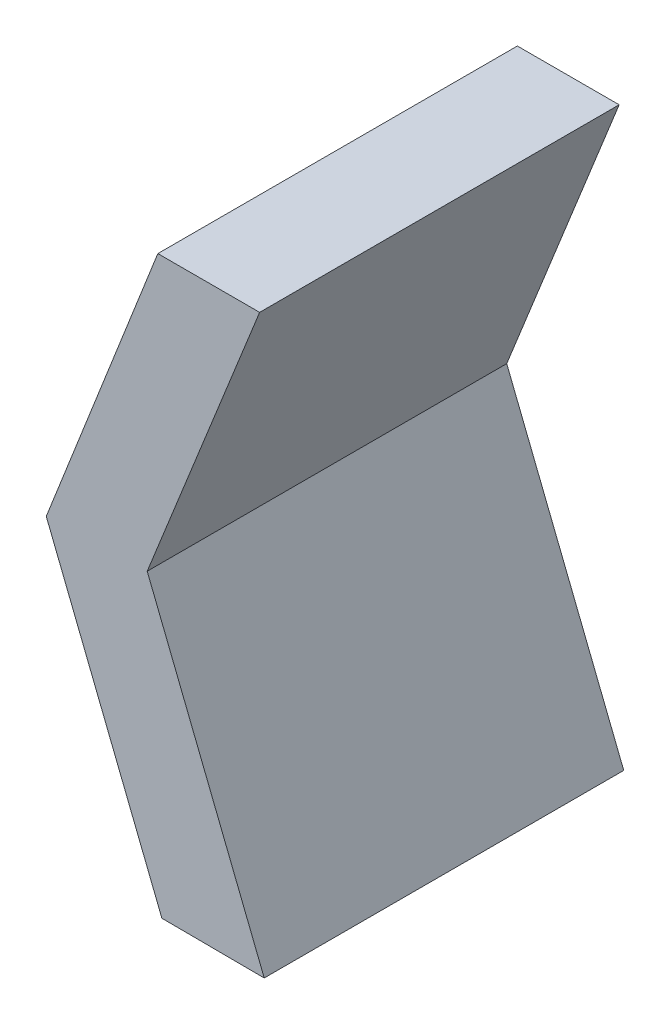
ISO-10303-21;
HEADER;
FILE_DESCRIPTION(('STEP AP214'),'2;1');
FILE_NAME('part.step','',(''),(''),'','','');
FILE_SCHEMA(('AUTOMOTIVE_DESIGN { 1 0 10303 214 1 1 1 1 }'));
ENDSEC;
DATA;
#1=APPLICATION_CONTEXT('core data for automotive mechanical design processes');
#2=APPLICATION_PROTOCOL_DEFINITION('international standard','automotive_design',2000,#1);
#3=PRODUCT_CONTEXT('',#1,'mechanical');
#4=PRODUCT('Part','Part','',(#3));
#5=PRODUCT_RELATED_PRODUCT_CATEGORY('part','',(#4));
#6=PRODUCT_DEFINITION_FORMATION('','',#4);
#7=PRODUCT_DEFINITION_CONTEXT('part definition',#1,'design');
#8=PRODUCT_DEFINITION('design','',#6,#7);
#9=PRODUCT_DEFINITION_SHAPE('','',#8);
#10=(LENGTH_UNIT() NAMED_UNIT(*) SI_UNIT(.MILLI.,.METRE.));
#11=(NAMED_UNIT(*) PLANE_ANGLE_UNIT() SI_UNIT($,.RADIAN.));
#12=(NAMED_UNIT(*) SI_UNIT($,.STERADIAN.) SOLID_ANGLE_UNIT());
#13=UNCERTAINTY_MEASURE_WITH_UNIT(LENGTH_MEASURE(1.E-05),#10,'distance_accuracy_value','');
#14=(GEOMETRIC_REPRESENTATION_CONTEXT(3) GLOBAL_UNCERTAINTY_ASSIGNED_CONTEXT((#13)) GLOBAL_UNIT_ASSIGNED_CONTEXT((#10,
#11,#12)) REPRESENTATION_CONTEXT('',''));
#15=CARTESIAN_POINT('',(0.,0.,0.));
#16=DIRECTION('',(0.,0.,1.));
#17=DIRECTION('',(1.,0.,0.));
#18=AXIS2_PLACEMENT_3D('',#15,#16,#17);
#19=CARTESIAN_POINT('',(6.08731782693,1.349599369236,0.));
#20=DIRECTION('',(0.,1.,0.));
#21=DIRECTION('',(-1.,0.,0.));
#22=AXIS2_PLACEMENT_3D('',#19,#20,#21);
#23=PLANE('',#22);
#24=DIRECTION('',(-1.,0.,0.));
#25=VECTOR('',#24,1.);
#26=CARTESIAN_POINT('',(6.08731782693,1.349599369236,0.));
#27=LINE('',#26,#25);
#28=CARTESIAN_POINT('',(6.08731782693,1.349599369236,0.));
#29=VERTEX_POINT('',#28);
#30=CARTESIAN_POINT('',(6.05900215416,1.349599369236,0.));
#31=VERTEX_POINT('',#30);
#32=EDGE_CURVE('E11',#29,#31,#27,.T.);
#33=ORIENTED_EDGE('',*,*,#32,.T.);
#34=DIRECTION('',(0.,0.,1.));
#35=VECTOR('',#34,1.);
#36=CARTESIAN_POINT('',(6.05900215416,1.349599369236,0.));
#37=LINE('',#36,#35);
#38=CARTESIAN_POINT('',(6.05900215416,1.349599369236,0.1));
#39=VERTEX_POINT('',#38);
#40=EDGE_CURVE('E24',#31,#39,#37,.T.);
#41=ORIENTED_EDGE('',*,*,#40,.T.);
#42=DIRECTION('',(-1.,0.,0.));
#43=VECTOR('',#42,1.);
#44=CARTESIAN_POINT('',(6.08731782693,1.349599369236,0.1));
#45=LINE('',#44,#43);
#46=CARTESIAN_POINT('',(6.08731782693,1.349599369236,0.1));
#47=VERTEX_POINT('',#46);
#48=EDGE_CURVE('E88',#47,#39,#45,.T.);
#49=ORIENTED_EDGE('',*,*,#48,.F.);
#50=DIRECTION('',(0.,0.,1.));
#51=VECTOR('',#50,1.);
#52=CARTESIAN_POINT('',(6.08731782693,1.349599369236,0.));
#53=LINE('',#52,#51);
#54=EDGE_CURVE('E116',#29,#47,#53,.T.);
#55=ORIENTED_EDGE('',*,*,#54,.F.);
#56=EDGE_LOOP('',(#33,#41,#49,#55));
#57=FACE_BOUND('',#56,.T.);
#58=ADVANCED_FACE('F17',(#57),#23,.T.);
#59=CARTESIAN_POINT('',(6.056042606951,1.27160146029,0.));
#60=DIRECTION('',(0.928164273204198,-0.372170769872278,0.));
#61=DIRECTION('',(0.372170769872278,0.928164273204198,0.));
#62=AXIS2_PLACEMENT_3D('',#59,#60,#61);
#63=PLANE('',#62);
#64=DIRECTION('',(0.372170769872278,0.928164273204197,0.));
#65=VECTOR('',#64,1.);
#66=CARTESIAN_POINT('',(6.056042606951,1.27160146029,0.));
#67=LINE('',#66,#65);
#68=CARTESIAN_POINT('',(6.056042606951,1.27160146029,0.));
#69=VERTEX_POINT('',#68);
#70=EDGE_CURVE('E113',#69,#29,#67,.T.);
#71=ORIENTED_EDGE('',*,*,#70,.T.);
#72=ORIENTED_EDGE('',*,*,#54,.T.);
#73=DIRECTION('',(0.372170769872278,0.928164273204197,0.));
#74=VECTOR('',#73,1.);
#75=CARTESIAN_POINT('',(6.056042606951,1.27160146029,0.1));
#76=LINE('',#75,#74);
#77=CARTESIAN_POINT('',(6.056042606951,1.27160146029,0.1));
#78=VERTEX_POINT('',#77);
#79=EDGE_CURVE('E111',#78,#47,#76,.T.);
#80=ORIENTED_EDGE('',*,*,#79,.F.);
#81=DIRECTION('',(0.,0.,1.));
#82=VECTOR('',#81,1.);
#83=CARTESIAN_POINT('',(6.056042606951,1.27160146029,0.));
#84=LINE('',#83,#82);
#85=EDGE_CURVE('E108',#69,#78,#84,.T.);
#86=ORIENTED_EDGE('',*,*,#85,.F.);
#87=EDGE_LOOP('',(#71,#72,#80,#86));
#88=FACE_BOUND('',#87,.T.);
#89=ADVANCED_FACE('F127',(#88),#63,.T.);
#90=CARTESIAN_POINT('',(6.088591321185,1.189890404642,0.));
#91=DIRECTION('',(0.929007780331414,0.370060189812008,0.));
#92=DIRECTION('',(-0.370060189812008,0.929007780331414,0.));
#93=AXIS2_PLACEMENT_3D('',#90,#91,#92);
#94=PLANE('',#93);
#95=DIRECTION('',(-0.370060189812008,0.929007780331414,0.));
#96=VECTOR('',#95,1.);
#97=CARTESIAN_POINT('',(6.088591321185,1.189890404642,0.));
#98=LINE('',#97,#96);
#99=CARTESIAN_POINT('',(6.088591321185,1.189890404642,0.));
#100=VERTEX_POINT('',#99);
#101=EDGE_CURVE('E105',#100,#69,#98,.T.);
#102=ORIENTED_EDGE('',*,*,#101,.T.);
#103=ORIENTED_EDGE('',*,*,#85,.T.);
#104=DIRECTION('',(-0.370060189812008,0.929007780331414,0.));
#105=VECTOR('',#104,1.);
#106=CARTESIAN_POINT('',(6.088591321185,1.189890404642,0.1));
#107=LINE('',#106,#105);
#108=CARTESIAN_POINT('',(6.088591321185,1.189890404642,0.1));
#109=VERTEX_POINT('',#108);
#110=EDGE_CURVE('E102',#109,#78,#107,.T.);
#111=ORIENTED_EDGE('',*,*,#110,.F.);
#112=DIRECTION('',(0.,0.,1.));
#113=VECTOR('',#112,1.);
#114=CARTESIAN_POINT('',(6.088591321185,1.189890404642,0.));
#115=LINE('',#114,#113);
#116=EDGE_CURVE('E99',#100,#109,#115,.T.);
#117=ORIENTED_EDGE('',*,*,#116,.F.);
#118=EDGE_LOOP('',(#102,#103,#111,#117));
#119=FACE_BOUND('',#118,.T.);
#120=ADVANCED_FACE('F124',(#119),#94,.T.);
#121=CARTESIAN_POINT('',(6.060125826906,1.190045426179,0.));
#122=DIRECTION('',(-0.00544586497042,-0.999985171167415,0.));
#123=DIRECTION('',(0.999985171167415,-0.00544586497042,0.));
#124=AXIS2_PLACEMENT_3D('',#121,#122,#123);
#125=PLANE('',#124);
#126=DIRECTION('',(0.999985171167415,-0.00544586497042,0.));
#127=VECTOR('',#126,1.);
#128=CARTESIAN_POINT('',(6.060125826906,1.190045426179,0.));
#129=LINE('',#128,#127);
#130=CARTESIAN_POINT('',(6.060125826906,1.190045426179,0.));
#131=VERTEX_POINT('',#130);
#132=EDGE_CURVE('E96',#131,#100,#129,.T.);
#133=ORIENTED_EDGE('',*,*,#132,.T.);
#134=ORIENTED_EDGE('',*,*,#116,.T.);
#135=DIRECTION('',(0.999985171167415,-0.00544586497042,0.));
#136=VECTOR('',#135,1.);
#137=CARTESIAN_POINT('',(6.060125826906,1.190045426179,0.1));
#138=LINE('',#137,#136);
#139=CARTESIAN_POINT('',(6.060125826906,1.190045426179,0.1));
#140=VERTEX_POINT('',#139);
#141=EDGE_CURVE('E94',#140,#109,#138,.T.);
#142=ORIENTED_EDGE('',*,*,#141,.F.);
#143=DIRECTION('',(0.,0.,1.));
#144=VECTOR('',#143,1.);
#145=CARTESIAN_POINT('',(6.060125826906,1.190045426179,0.));
#146=LINE('',#145,#144);
#147=EDGE_CURVE('E73',#131,#140,#146,.T.);
#148=ORIENTED_EDGE('',*,*,#147,.F.);
#149=EDGE_LOOP('',(#133,#134,#142,#148));
#150=FACE_BOUND('',#149,.T.);
#151=ADVANCED_FACE('F122',(#150),#125,.T.);
#152=CARTESIAN_POINT('',(6.027965321206,1.270781914017,0.));
#153=DIRECTION('',(-0.929007780331408,-0.370060189812023,0.));
#154=DIRECTION('',(0.370060189812023,-0.929007780331408,0.));
#155=AXIS2_PLACEMENT_3D('',#152,#153,#154);
#156=PLANE('',#155);
#157=DIRECTION('',(0.370060189812022,-0.929007780331408,0.));
#158=VECTOR('',#157,1.);
#159=CARTESIAN_POINT('',(6.027669026906,1.271525738179,0.));
#160=LINE('',#159,#158);
#161=CARTESIAN_POINT('',(6.027965321206,1.270781914017,0.));
#162=VERTEX_POINT('',#161);
#163=EDGE_CURVE('E77',#162,#131,#160,.T.);
#164=ORIENTED_EDGE('',*,*,#163,.T.);
#165=ORIENTED_EDGE('',*,*,#147,.T.);
#166=DIRECTION('',(0.370060189812022,-0.929007780331408,0.));
#167=VECTOR('',#166,1.);
#168=CARTESIAN_POINT('',(6.027669026906,1.271525738179,0.1));
#169=LINE('',#168,#167);
#170=CARTESIAN_POINT('',(6.027965321206,1.270781914017,0.1));
#171=VERTEX_POINT('',#170);
#172=EDGE_CURVE('E66',#171,#140,#169,.T.);
#173=ORIENTED_EDGE('',*,*,#172,.F.);
#174=DIRECTION('',(0.,0.,1.));
#175=VECTOR('',#174,1.);
#176=CARTESIAN_POINT('',(6.027965321206,1.270781914017,0.));
#177=LINE('',#176,#175);
#178=EDGE_CURVE('E70',#162,#171,#177,.T.);
#179=ORIENTED_EDGE('',*,*,#178,.F.);
#180=EDGE_LOOP('',(#164,#165,#173,#179));
#181=FACE_BOUND('',#180,.T.);
#182=ADVANCED_FACE('F69',(#181),#156,.T.);
#183=CARTESIAN_POINT('',(6.05900215416,1.349599369236,0.));
#184=DIRECTION('',(-0.930458575998283,0.366397104725526,0.));
#185=DIRECTION('',(-0.366397104725526,-0.930458575998283,0.));
#186=AXIS2_PLACEMENT_3D('',#183,#184,#185);
#187=PLANE('',#186);
#188=DIRECTION('',(-0.366397104725526,-0.930458575998283,0.));
#189=VECTOR('',#188,1.);
#190=CARTESIAN_POINT('',(6.05900215416,1.349599369236,0.));
#191=LINE('',#190,#189);
#192=EDGE_CURVE('E83',#31,#162,#191,.T.);
#193=ORIENTED_EDGE('',*,*,#192,.T.);
#194=ORIENTED_EDGE('',*,*,#178,.T.);
#195=DIRECTION('',(-0.366397104725526,-0.930458575998283,0.));
#196=VECTOR('',#195,1.);
#197=CARTESIAN_POINT('',(6.05900215416,1.349599369236,0.1));
#198=LINE('',#197,#196);
#199=EDGE_CURVE('E82',#39,#171,#198,.T.);
#200=ORIENTED_EDGE('',*,*,#199,.F.);
#201=ORIENTED_EDGE('',*,*,#40,.F.);
#202=EDGE_LOOP('',(#193,#194,#200,#201));
#203=FACE_BOUND('',#202,.T.);
#204=ADVANCED_FACE('F81',(#203),#187,.T.);
#205=CARTESIAN_POINT('',(6.060151471178,1.269748103616,0.1));
#206=DIRECTION('',(0.,0.,1.));
#207=DIRECTION('',(1.,0.,0.));
#208=AXIS2_PLACEMENT_3D('',#205,#206,#207);
#209=PLANE('',#208);
#210=ORIENTED_EDGE('',*,*,#199,.T.);
#211=ORIENTED_EDGE('',*,*,#172,.T.);
#212=ORIENTED_EDGE('',*,*,#141,.T.);
#213=ORIENTED_EDGE('',*,*,#110,.T.);
#214=ORIENTED_EDGE('',*,*,#79,.T.);
#215=ORIENTED_EDGE('',*,*,#48,.T.);
#216=EDGE_LOOP('',(#210,#211,#212,#213,#214,#215));
#217=FACE_BOUND('',#216,.T.);
#218=ADVANCED_FACE('F86',(#217),#209,.T.);
#219=CARTESIAN_POINT('',(6.060151471178,1.269748103616,0.));
#220=DIRECTION('',(0.,0.,1.));
#221=DIRECTION('',(1.,0.,0.));
#222=AXIS2_PLACEMENT_3D('',#219,#220,#221);
#223=PLANE('',#222);
#224=ORIENTED_EDGE('',*,*,#192,.F.);
#225=ORIENTED_EDGE('',*,*,#32,.F.);
#226=ORIENTED_EDGE('',*,*,#70,.F.);
#227=ORIENTED_EDGE('',*,*,#101,.F.);
#228=ORIENTED_EDGE('',*,*,#132,.F.);
#229=ORIENTED_EDGE('',*,*,#163,.F.);
#230=EDGE_LOOP('',(#224,#225,#226,#227,#228,#229));
#231=FACE_BOUND('',#230,.T.);
#232=ADVANCED_FACE('F119',(#231),#223,.F.);
#233=CLOSED_SHELL('',(#58,#89,#120,#151,#182,#204,#218,#232));
#234=MANIFOLD_SOLID_BREP('B1',#233);
#235=ADVANCED_BREP_SHAPE_REPRESENTATION('',(#18,#234),#14);
#236=SHAPE_DEFINITION_REPRESENTATION(#9,#235);
ENDSEC;
END-ISO-10303-21;
